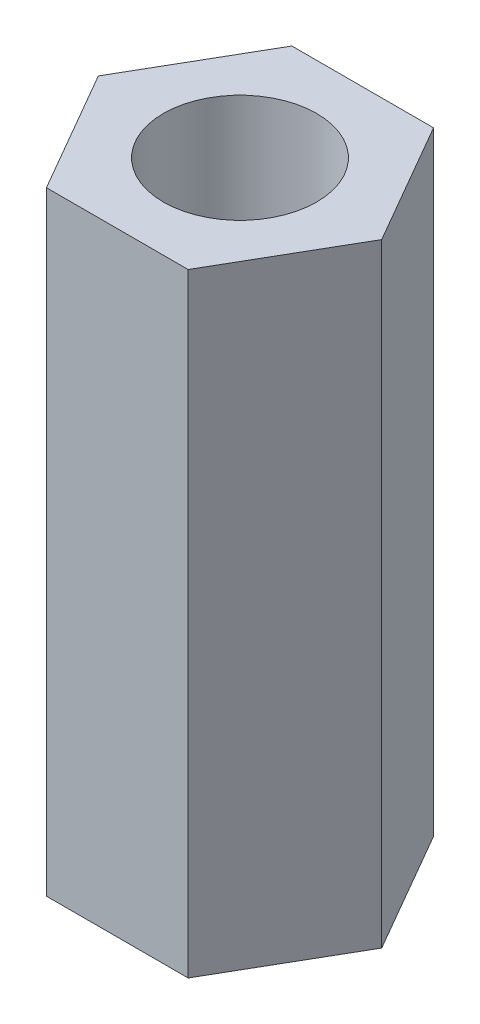
ISO-10303-21;
HEADER;
FILE_DESCRIPTION(('STEP AP214'),'2;1');
FILE_NAME('part.step','',(''),(''),'','','');
FILE_SCHEMA(('AUTOMOTIVE_DESIGN { 1 0 10303 214 1 1 1 1 }'));
ENDSEC;
DATA;
#1=APPLICATION_CONTEXT('core data for automotive mechanical design processes');
#2=APPLICATION_PROTOCOL_DEFINITION('international standard','automotive_design',2000,#1);
#3=PRODUCT_CONTEXT('',#1,'mechanical');
#4=PRODUCT('Part','Part','',(#3));
#5=PRODUCT_RELATED_PRODUCT_CATEGORY('part','',(#4));
#6=PRODUCT_DEFINITION_FORMATION('','',#4);
#7=PRODUCT_DEFINITION_CONTEXT('part definition',#1,'design');
#8=PRODUCT_DEFINITION('design','',#6,#7);
#9=PRODUCT_DEFINITION_SHAPE('','',#8);
#10=(LENGTH_UNIT() NAMED_UNIT(*) SI_UNIT(.MILLI.,.METRE.));
#11=(NAMED_UNIT(*) PLANE_ANGLE_UNIT() SI_UNIT($,.RADIAN.));
#12=(NAMED_UNIT(*) SI_UNIT($,.STERADIAN.) SOLID_ANGLE_UNIT());
#13=UNCERTAINTY_MEASURE_WITH_UNIT(LENGTH_MEASURE(1.E-05),#10,'distance_accuracy_value','');
#14=(GEOMETRIC_REPRESENTATION_CONTEXT(3) GLOBAL_UNCERTAINTY_ASSIGNED_CONTEXT((#13)) GLOBAL_UNIT_ASSIGNED_CONTEXT((#10,
#11,#12)) REPRESENTATION_CONTEXT('',''));
#15=CARTESIAN_POINT('',(0.,0.,0.));
#16=DIRECTION('',(0.,0.,1.));
#17=DIRECTION('',(1.,0.,0.));
#18=AXIS2_PLACEMENT_3D('',#15,#16,#17);
#19=CARTESIAN_POINT('',(0.,10.,0.));
#20=DIRECTION('',(0.,1.,0.));
#21=DIRECTION('',(0.,0.,1.));
#22=AXIS2_PLACEMENT_3D('',#19,#20,#21);
#23=PLANE('',#22);
#24=DIRECTION('',(-0.5,0.,-0.866025403784438));
#25=VECTOR('',#24,1.);
#26=CARTESIAN_POINT('',(2.30940107675851,10.,0.));
#27=LINE('',#26,#25);
#28=CARTESIAN_POINT('',(2.30940107675851,10.,0.));
#29=VERTEX_POINT('',#28);
#30=CARTESIAN_POINT('',(1.15470053837925,10.,-2.00000000000001));
#31=VERTEX_POINT('',#30);
#32=EDGE_CURVE('E152',#29,#31,#27,.T.);
#33=ORIENTED_EDGE('',*,*,#32,.T.);
#34=DIRECTION('',(-1.,0.,0.));
#35=VECTOR('',#34,1.);
#36=CARTESIAN_POINT('',(1.15470053837925,10.,-2.00000000000001));
#37=LINE('',#36,#35);
#38=CARTESIAN_POINT('',(-1.15470053837925,10.,-2.00000000000001));
#39=VERTEX_POINT('',#38);
#40=EDGE_CURVE('E100',#31,#39,#37,.T.);
#41=ORIENTED_EDGE('',*,*,#40,.T.);
#42=DIRECTION('',(-0.499999999999999,0.,0.866025403784439));
#43=VECTOR('',#42,1.);
#44=CARTESIAN_POINT('',(-1.15470053837925,10.,-2.00000000000001));
#45=LINE('',#44,#43);
#46=CARTESIAN_POINT('',(-2.3094010767585,10.,0.));
#47=VERTEX_POINT('',#46);
#48=EDGE_CURVE('E113',#39,#47,#45,.T.);
#49=ORIENTED_EDGE('',*,*,#48,.T.);
#50=DIRECTION('',(0.5,0.,0.866025403784439));
#51=VECTOR('',#50,1.);
#52=CARTESIAN_POINT('',(-2.3094010767585,10.,0.));
#53=LINE('',#52,#51);
#54=CARTESIAN_POINT('',(-1.15470053837925,10.,2.));
#55=VERTEX_POINT('',#54);
#56=EDGE_CURVE('E107',#47,#55,#53,.T.);
#57=ORIENTED_EDGE('',*,*,#56,.T.);
#58=DIRECTION('',(1.,0.,0.));
#59=VECTOR('',#58,1.);
#60=CARTESIAN_POINT('',(-1.15470053837925,10.,2.));
#61=LINE('',#60,#59);
#62=CARTESIAN_POINT('',(1.15470053837926,10.,2.));
#63=VERTEX_POINT('',#62);
#64=EDGE_CURVE('E111',#55,#63,#61,.T.);
#65=ORIENTED_EDGE('',*,*,#64,.T.);
#66=DIRECTION('',(0.5,0.,-0.866025403784439));
#67=VECTOR('',#66,1.);
#68=CARTESIAN_POINT('',(1.15470053837926,10.,2.));
#69=LINE('',#68,#67);
#70=EDGE_CURVE('E63',#63,#29,#69,.T.);
#71=ORIENTED_EDGE('',*,*,#70,.T.);
#72=EDGE_LOOP('',(#33,#41,#49,#57,#65,#71));
#73=FACE_BOUND('',#72,.T.);
#74=CARTESIAN_POINT('',(0.,10.,0.));
#75=DIRECTION('',(0.,1.,0.));
#76=DIRECTION('',(0.,0.,1.));
#77=AXIS2_PLACEMENT_3D('',#74,#75,#76);
#78=CIRCLE('',#77,1.25);
#79=CARTESIAN_POINT('',(0.,10.,1.25));
#80=VERTEX_POINT('',#79);
#81=EDGE_CURVE('E140',#80,#80,#78,.T.);
#82=ORIENTED_EDGE('',*,*,#81,.F.);
#83=EDGE_LOOP('',(#82));
#84=FACE_BOUND('',#83,.T.);
#85=ADVANCED_FACE('F45',(#73,#84),#23,.T.);
#86=CARTESIAN_POINT('',(0.,0.,0.));
#87=DIRECTION('',(0.,1.,0.));
#88=DIRECTION('',(0.,0.,1.));
#89=AXIS2_PLACEMENT_3D('',#86,#87,#88);
#90=PLANE('',#89);
#91=DIRECTION('',(-0.5,0.,-0.866025403784438));
#92=VECTOR('',#91,1.);
#93=CARTESIAN_POINT('',(2.30940107675851,0.,0.));
#94=LINE('',#93,#92);
#95=CARTESIAN_POINT('',(2.30940107675851,0.,0.));
#96=VERTEX_POINT('',#95);
#97=CARTESIAN_POINT('',(1.15470053837925,0.,-2.00000000000001));
#98=VERTEX_POINT('',#97);
#99=EDGE_CURVE('E135',#96,#98,#94,.T.);
#100=ORIENTED_EDGE('',*,*,#99,.F.);
#101=DIRECTION('',(0.5,0.,-0.866025403784439));
#102=VECTOR('',#101,1.);
#103=CARTESIAN_POINT('',(1.15470053837926,0.,2.));
#104=LINE('',#103,#102);
#105=CARTESIAN_POINT('',(1.15470053837926,0.,2.));
#106=VERTEX_POINT('',#105);
#107=EDGE_CURVE('E92',#106,#96,#104,.T.);
#108=ORIENTED_EDGE('',*,*,#107,.F.);
#109=DIRECTION('',(1.,0.,0.));
#110=VECTOR('',#109,1.);
#111=CARTESIAN_POINT('',(-1.15470053837925,0.,2.));
#112=LINE('',#111,#110);
#113=CARTESIAN_POINT('',(-1.15470053837925,0.,2.));
#114=VERTEX_POINT('',#113);
#115=EDGE_CURVE('E86',#114,#106,#112,.T.);
#116=ORIENTED_EDGE('',*,*,#115,.F.);
#117=DIRECTION('',(0.5,0.,0.866025403784439));
#118=VECTOR('',#117,1.);
#119=CARTESIAN_POINT('',(-2.3094010767585,0.,0.));
#120=LINE('',#119,#118);
#121=CARTESIAN_POINT('',(-2.3094010767585,0.,0.));
#122=VERTEX_POINT('',#121);
#123=EDGE_CURVE('E122',#122,#114,#120,.T.);
#124=ORIENTED_EDGE('',*,*,#123,.F.);
#125=DIRECTION('',(-0.499999999999999,0.,0.866025403784439));
#126=VECTOR('',#125,1.);
#127=CARTESIAN_POINT('',(-1.15470053837925,0.,-2.00000000000001));
#128=LINE('',#127,#126);
#129=CARTESIAN_POINT('',(-1.15470053837925,0.,-2.00000000000001));
#130=VERTEX_POINT('',#129);
#131=EDGE_CURVE('E143',#130,#122,#128,.T.);
#132=ORIENTED_EDGE('',*,*,#131,.F.);
#133=DIRECTION('',(-1.,0.,0.));
#134=VECTOR('',#133,1.);
#135=CARTESIAN_POINT('',(1.15470053837925,0.,-2.00000000000001));
#136=LINE('',#135,#134);
#137=EDGE_CURVE('E139',#98,#130,#136,.T.);
#138=ORIENTED_EDGE('',*,*,#137,.F.);
#139=EDGE_LOOP('',(#100,#108,#116,#124,#132,#138));
#140=FACE_BOUND('',#139,.T.);
#141=CARTESIAN_POINT('',(0.,0.,0.));
#142=DIRECTION('',(0.,1.,0.));
#143=DIRECTION('',(0.,0.,1.));
#144=AXIS2_PLACEMENT_3D('',#141,#142,#143);
#145=CIRCLE('',#144,1.25);
#146=CARTESIAN_POINT('',(0.,0.,1.25));
#147=VERTEX_POINT('',#146);
#148=EDGE_CURVE('E249',#147,#147,#145,.T.);
#149=ORIENTED_EDGE('',*,*,#148,.T.);
#150=EDGE_LOOP('',(#149));
#151=FACE_BOUND('',#150,.T.);
#152=ADVANCED_FACE('F165',(#140,#151),#90,.F.);
#153=CARTESIAN_POINT('',(2.30940107675851,10.,0.));
#154=DIRECTION('',(-0.866025403784438,0.,0.5));
#155=DIRECTION('',(0.5,0.,0.866025403784438));
#156=AXIS2_PLACEMENT_3D('',#153,#154,#155);
#157=PLANE('',#156);
#158=ORIENTED_EDGE('',*,*,#99,.T.);
#159=DIRECTION('',(0.,-1.,0.));
#160=VECTOR('',#159,1.);
#161=CARTESIAN_POINT('',(1.15470053837925,10.,-2.00000000000001));
#162=LINE('',#161,#160);
#163=EDGE_CURVE('E11',#31,#98,#162,.T.);
#164=ORIENTED_EDGE('',*,*,#163,.F.);
#165=ORIENTED_EDGE('',*,*,#32,.F.);
#166=DIRECTION('',(0.,-1.,0.));
#167=VECTOR('',#166,1.);
#168=CARTESIAN_POINT('',(2.30940107675851,10.,0.));
#169=LINE('',#168,#167);
#170=EDGE_CURVE('E131',#29,#96,#169,.T.);
#171=ORIENTED_EDGE('',*,*,#170,.T.);
#172=EDGE_LOOP('',(#158,#164,#165,#171));
#173=FACE_BOUND('',#172,.T.);
#174=ADVANCED_FACE('F47',(#173),#157,.F.);
#175=CARTESIAN_POINT('',(1.15470053837925,10.,-2.00000000000001));
#176=DIRECTION('',(0.,0.,1.));
#177=DIRECTION('',(1.,0.,0.));
#178=AXIS2_PLACEMENT_3D('',#175,#176,#177);
#179=PLANE('',#178);
#180=ORIENTED_EDGE('',*,*,#137,.T.);
#181=DIRECTION('',(0.,-1.,0.));
#182=VECTOR('',#181,1.);
#183=CARTESIAN_POINT('',(-1.15470053837925,10.,-2.00000000000001));
#184=LINE('',#183,#182);
#185=EDGE_CURVE('E55',#39,#130,#184,.T.);
#186=ORIENTED_EDGE('',*,*,#185,.F.);
#187=ORIENTED_EDGE('',*,*,#40,.F.);
#188=ORIENTED_EDGE('',*,*,#163,.T.);
#189=EDGE_LOOP('',(#180,#186,#187,#188));
#190=FACE_BOUND('',#189,.T.);
#191=ADVANCED_FACE('F190',(#190),#179,.F.);
#192=CARTESIAN_POINT('',(-1.15470053837925,10.,-2.00000000000001));
#193=DIRECTION('',(0.866025403784439,0.,0.499999999999999));
#194=DIRECTION('',(0.499999999999999,0.,-0.866025403784439));
#195=AXIS2_PLACEMENT_3D('',#192,#193,#194);
#196=PLANE('',#195);
#197=ORIENTED_EDGE('',*,*,#131,.T.);
#198=DIRECTION('',(0.,-1.,0.));
#199=VECTOR('',#198,1.);
#200=CARTESIAN_POINT('',(-2.3094010767585,10.,0.));
#201=LINE('',#200,#199);
#202=EDGE_CURVE('E124',#47,#122,#201,.T.);
#203=ORIENTED_EDGE('',*,*,#202,.F.);
#204=ORIENTED_EDGE('',*,*,#48,.F.);
#205=ORIENTED_EDGE('',*,*,#185,.T.);
#206=EDGE_LOOP('',(#197,#203,#204,#205));
#207=FACE_BOUND('',#206,.T.);
#208=ADVANCED_FACE('F162',(#207),#196,.F.);
#209=CARTESIAN_POINT('',(-2.3094010767585,10.,0.));
#210=DIRECTION('',(0.866025403784439,0.,-0.5));
#211=DIRECTION('',(-0.5,0.,-0.866025403784439));
#212=AXIS2_PLACEMENT_3D('',#209,#210,#211);
#213=PLANE('',#212);
#214=ORIENTED_EDGE('',*,*,#123,.T.);
#215=DIRECTION('',(0.,-1.,0.));
#216=VECTOR('',#215,1.);
#217=CARTESIAN_POINT('',(-1.15470053837925,10.,2.));
#218=LINE('',#217,#216);
#219=EDGE_CURVE('E119',#55,#114,#218,.T.);
#220=ORIENTED_EDGE('',*,*,#219,.F.);
#221=ORIENTED_EDGE('',*,*,#56,.F.);
#222=ORIENTED_EDGE('',*,*,#202,.T.);
#223=EDGE_LOOP('',(#214,#220,#221,#222));
#224=FACE_BOUND('',#223,.T.);
#225=ADVANCED_FACE('F120',(#224),#213,.F.);
#226=CARTESIAN_POINT('',(-1.15470053837925,10.,2.));
#227=DIRECTION('',(0.,0.,-1.));
#228=DIRECTION('',(-1.,0.,0.));
#229=AXIS2_PLACEMENT_3D('',#226,#227,#228);
#230=PLANE('',#229);
#231=ORIENTED_EDGE('',*,*,#115,.T.);
#232=DIRECTION('',(0.,-1.,0.));
#233=VECTOR('',#232,1.);
#234=CARTESIAN_POINT('',(1.15470053837926,10.,2.));
#235=LINE('',#234,#233);
#236=EDGE_CURVE('E125',#63,#106,#235,.T.);
#237=ORIENTED_EDGE('',*,*,#236,.F.);
#238=ORIENTED_EDGE('',*,*,#64,.F.);
#239=ORIENTED_EDGE('',*,*,#219,.T.);
#240=EDGE_LOOP('',(#231,#237,#238,#239));
#241=FACE_BOUND('',#240,.T.);
#242=ADVANCED_FACE('F127',(#241),#230,.F.);
#243=CARTESIAN_POINT('',(1.15470053837926,10.,2.));
#244=DIRECTION('',(-0.866025403784439,0.,-0.5));
#245=DIRECTION('',(-0.5,0.,0.866025403784439));
#246=AXIS2_PLACEMENT_3D('',#243,#244,#245);
#247=PLANE('',#246);
#248=ORIENTED_EDGE('',*,*,#107,.T.);
#249=ORIENTED_EDGE('',*,*,#170,.F.);
#250=ORIENTED_EDGE('',*,*,#70,.F.);
#251=ORIENTED_EDGE('',*,*,#236,.T.);
#252=EDGE_LOOP('',(#248,#249,#250,#251));
#253=FACE_BOUND('',#252,.T.);
#254=ADVANCED_FACE('F170',(#253),#247,.F.);
#255=CARTESIAN_POINT('',(0.,10.,0.));
#256=DIRECTION('',(0.,-1.,0.));
#257=DIRECTION('',(0.,0.,-1.));
#258=AXIS2_PLACEMENT_3D('',#255,#256,#257);
#259=CYLINDRICAL_SURFACE('',#258,1.25);
#260=ORIENTED_EDGE('',*,*,#81,.T.);
#261=EDGE_LOOP('',(#260));
#262=FACE_BOUND('',#261,.T.);
#263=ORIENTED_EDGE('',*,*,#148,.F.);
#264=EDGE_LOOP('',(#263));
#265=FACE_BOUND('',#264,.T.);
#266=ADVANCED_FACE('F172',(#262,#265),#259,.F.);
#267=CLOSED_SHELL('',(#85,#152,#174,#191,#208,#225,#242,#254,#266));
#268=MANIFOLD_SOLID_BREP('B2',#267);
#269=ADVANCED_BREP_SHAPE_REPRESENTATION('',(#18,#268),#14);
#270=SHAPE_DEFINITION_REPRESENTATION(#9,#269);
ENDSEC;
END-ISO-10303-21;
